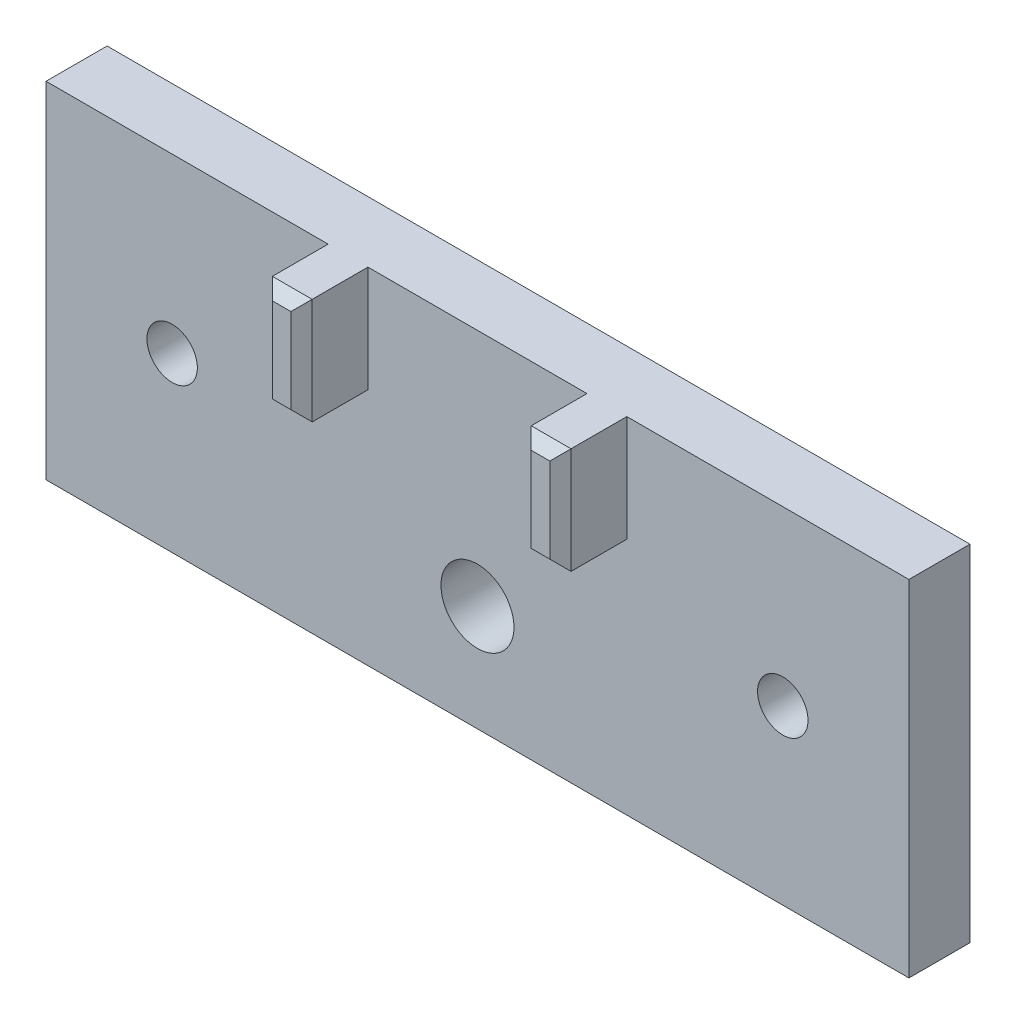
ISO-10303-21;
HEADER;
FILE_DESCRIPTION(('STEP AP214'),'2;1');
FILE_NAME('part.step','',(''),(''),'','','');
FILE_SCHEMA(('AUTOMOTIVE_DESIGN { 1 0 10303 214 1 1 1 1 }'));
ENDSEC;
DATA;
#1=APPLICATION_CONTEXT('core data for automotive mechanical design processes');
#2=APPLICATION_PROTOCOL_DEFINITION('international standard','automotive_design',2000,#1);
#3=PRODUCT_CONTEXT('',#1,'mechanical');
#4=PRODUCT('Part','Part','',(#3));
#5=PRODUCT_RELATED_PRODUCT_CATEGORY('part','',(#4));
#6=PRODUCT_DEFINITION_FORMATION('','',#4);
#7=PRODUCT_DEFINITION_CONTEXT('part definition',#1,'design');
#8=PRODUCT_DEFINITION('design','',#6,#7);
#9=PRODUCT_DEFINITION_SHAPE('','',#8);
#10=(LENGTH_UNIT() NAMED_UNIT(*) SI_UNIT(.MILLI.,.METRE.));
#11=(NAMED_UNIT(*) PLANE_ANGLE_UNIT() SI_UNIT($,.RADIAN.));
#12=(NAMED_UNIT(*) SI_UNIT($,.STERADIAN.) SOLID_ANGLE_UNIT());
#13=UNCERTAINTY_MEASURE_WITH_UNIT(LENGTH_MEASURE(1.E-05),#10,'distance_accuracy_value','');
#14=(GEOMETRIC_REPRESENTATION_CONTEXT(3) GLOBAL_UNCERTAINTY_ASSIGNED_CONTEXT((#13)) GLOBAL_UNIT_ASSIGNED_CONTEXT((#10,
#11,#12)) REPRESENTATION_CONTEXT('',''));
#15=CARTESIAN_POINT('',(0.,0.,0.));
#16=DIRECTION('',(0.,0.,1.));
#17=DIRECTION('',(1.,0.,0.));
#18=AXIS2_PLACEMENT_3D('',#15,#16,#17);
#19=CARTESIAN_POINT('',(0.,0.,5.));
#20=DIRECTION('',(0.,0.,-1.));
#21=DIRECTION('',(-1.,0.,0.));
#22=AXIS2_PLACEMENT_3D('',#19,#20,#21);
#23=PLANE('',#22);
#24=CARTESIAN_POINT('',(55.5,13.,5.));
#25=DIRECTION('',(0.,0.,-1.));
#26=DIRECTION('',(-1.,0.,0.));
#27=AXIS2_PLACEMENT_3D('',#24,#25,#26);
#28=CIRCLE('',#27,1.9);
#29=CARTESIAN_POINT('',(53.6,13.,5.));
#30=VERTEX_POINT('',#29);
#31=EDGE_CURVE('E288',#30,#30,#28,.T.);
#32=ORIENTED_EDGE('',*,*,#31,.T.);
#33=EDGE_LOOP('',(#32));
#34=FACE_BOUND('',#33,.T.);
#35=CARTESIAN_POINT('',(9.5,13.,5.));
#36=DIRECTION('',(0.,0.,-1.));
#37=DIRECTION('',(-1.,0.,0.));
#38=AXIS2_PLACEMENT_3D('',#35,#36,#37);
#39=CIRCLE('',#38,1.9);
#40=CARTESIAN_POINT('',(7.6,13.,5.));
#41=VERTEX_POINT('',#40);
#42=EDGE_CURVE('E199',#41,#41,#39,.T.);
#43=ORIENTED_EDGE('',*,*,#42,.T.);
#44=EDGE_LOOP('',(#43));
#45=FACE_BOUND('',#44,.T.);
#46=CARTESIAN_POINT('',(32.5,8.,5.));
#47=DIRECTION('',(0.,0.,1.));
#48=DIRECTION('',(1.,0.,0.));
#49=AXIS2_PLACEMENT_3D('',#46,#47,#48);
#50=CIRCLE('',#49,2.75);
#51=CARTESIAN_POINT('',(35.25,8.,5.));
#52=VERTEX_POINT('',#51);
#53=EDGE_CURVE('E224',#52,#52,#50,.T.);
#54=ORIENTED_EDGE('',*,*,#53,.F.);
#55=EDGE_LOOP('',(#54));
#56=FACE_BOUND('',#55,.T.);
#57=DIRECTION('',(0.,-1.,0.));
#58=VECTOR('',#57,1.);
#59=CARTESIAN_POINT('',(40.75,26.,5.));
#60=LINE('',#59,#58);
#61=CARTESIAN_POINT('',(40.75,26.,5.));
#62=VERTEX_POINT('',#61);
#63=CARTESIAN_POINT('',(40.75,18.,5.));
#64=VERTEX_POINT('',#63);
#65=EDGE_CURVE('E168',#62,#64,#60,.T.);
#66=ORIENTED_EDGE('',*,*,#65,.F.);
#67=DIRECTION('',(-1.,0.,0.));
#68=VECTOR('',#67,1.);
#69=CARTESIAN_POINT('',(0.,26.,5.));
#70=LINE('',#69,#68);
#71=CARTESIAN_POINT('',(24.25,26.,5.));
#72=VERTEX_POINT('',#71);
#73=EDGE_CURVE('E177',#62,#72,#70,.T.);
#74=ORIENTED_EDGE('',*,*,#73,.T.);
#75=DIRECTION('',(0.,1.,0.));
#76=VECTOR('',#75,1.);
#77=CARTESIAN_POINT('',(24.25,26.,5.));
#78=LINE('',#77,#76);
#79=CARTESIAN_POINT('',(24.25,18.,5.));
#80=VERTEX_POINT('',#79);
#81=EDGE_CURVE('E215',#80,#72,#78,.T.);
#82=ORIENTED_EDGE('',*,*,#81,.F.);
#83=DIRECTION('',(1.,0.,0.));
#84=VECTOR('',#83,1.);
#85=CARTESIAN_POINT('',(21.25,18.,5.));
#86=LINE('',#85,#84);
#87=CARTESIAN_POINT('',(21.25,18.,5.));
#88=VERTEX_POINT('',#87);
#89=EDGE_CURVE('E212',#88,#80,#86,.T.);
#90=ORIENTED_EDGE('',*,*,#89,.F.);
#91=DIRECTION('',(0.,-1.,0.));
#92=VECTOR('',#91,1.);
#93=CARTESIAN_POINT('',(21.25,26.,5.));
#94=LINE('',#93,#92);
#95=CARTESIAN_POINT('',(21.25,26.,5.));
#96=VERTEX_POINT('',#95);
#97=EDGE_CURVE('E209',#96,#88,#94,.T.);
#98=ORIENTED_EDGE('',*,*,#97,.F.);
#99=CARTESIAN_POINT('',(0.,26.,5.));
#100=VERTEX_POINT('',#99);
#101=EDGE_CURVE('E186',#96,#100,#70,.T.);
#102=ORIENTED_EDGE('',*,*,#101,.T.);
#103=DIRECTION('',(0.,-1.,0.));
#104=VECTOR('',#103,1.);
#105=CARTESIAN_POINT('',(0.,0.,5.));
#106=LINE('',#105,#104);
#107=CARTESIAN_POINT('',(0.,0.,5.));
#108=VERTEX_POINT('',#107);
#109=EDGE_CURVE('E227',#100,#108,#106,.T.);
#110=ORIENTED_EDGE('',*,*,#109,.T.);
#111=DIRECTION('',(1.,0.,0.));
#112=VECTOR('',#111,1.);
#113=CARTESIAN_POINT('',(0.,0.,5.));
#114=LINE('',#113,#112);
#115=CARTESIAN_POINT('',(65.,0.,5.));
#116=VERTEX_POINT('',#115);
#117=EDGE_CURVE('E230',#108,#116,#114,.T.);
#118=ORIENTED_EDGE('',*,*,#117,.T.);
#119=DIRECTION('',(0.,1.,0.));
#120=VECTOR('',#119,1.);
#121=CARTESIAN_POINT('',(65.,0.,5.));
#122=LINE('',#121,#120);
#123=CARTESIAN_POINT('',(65.,26.,5.));
#124=VERTEX_POINT('',#123);
#125=EDGE_CURVE('E232',#116,#124,#122,.T.);
#126=ORIENTED_EDGE('',*,*,#125,.T.);
#127=CARTESIAN_POINT('',(43.75,26.,5.));
#128=VERTEX_POINT('',#127);
#129=EDGE_CURVE('E185',#124,#128,#70,.T.);
#130=ORIENTED_EDGE('',*,*,#129,.T.);
#131=DIRECTION('',(0.,1.,0.));
#132=VECTOR('',#131,1.);
#133=CARTESIAN_POINT('',(43.75,26.,5.));
#134=LINE('',#133,#132);
#135=CARTESIAN_POINT('',(43.75,18.,5.));
#136=VERTEX_POINT('',#135);
#137=EDGE_CURVE('E174',#136,#128,#134,.T.);
#138=ORIENTED_EDGE('',*,*,#137,.F.);
#139=DIRECTION('',(1.,0.,0.));
#140=VECTOR('',#139,1.);
#141=CARTESIAN_POINT('',(40.75,18.,5.));
#142=LINE('',#141,#140);
#143=EDGE_CURVE('E191',#64,#136,#142,.T.);
#144=ORIENTED_EDGE('',*,*,#143,.F.);
#145=EDGE_LOOP('',(#66,#74,#82,#90,#98,#102,#110,#118,#126,#130,#138,#144));
#146=FACE_BOUND('',#145,.T.);
#147=ADVANCED_FACE('F33',(#34,#45,#56,#146),#23,.F.);
#148=CARTESIAN_POINT('',(0.,0.,5.));
#149=DIRECTION('',(1.,0.,0.));
#150=DIRECTION('',(0.,0.,-1.));
#151=AXIS2_PLACEMENT_3D('',#148,#149,#150);
#152=PLANE('',#151);
#153=DIRECTION('',(0.,0.,-1.));
#154=VECTOR('',#153,1.);
#155=CARTESIAN_POINT('',(0.,26.,5.));
#156=LINE('',#155,#154);
#157=CARTESIAN_POINT('',(0.,26.,0.399999999999998));
#158=VERTEX_POINT('',#157);
#159=EDGE_CURVE('E235',#100,#158,#156,.T.);
#160=ORIENTED_EDGE('',*,*,#159,.T.);
#161=DIRECTION('',(0.,-1.,0.));
#162=VECTOR('',#161,1.);
#163=CARTESIAN_POINT('',(0.,0.,0.399999999999998));
#164=LINE('',#163,#162);
#165=CARTESIAN_POINT('',(0.,0.,0.399999999999998));
#166=VERTEX_POINT('',#165);
#167=EDGE_CURVE('E317',#158,#166,#164,.T.);
#168=ORIENTED_EDGE('',*,*,#167,.T.);
#169=DIRECTION('',(0.,0.,-1.));
#170=VECTOR('',#169,1.);
#171=CARTESIAN_POINT('',(0.,0.,5.));
#172=LINE('',#171,#170);
#173=EDGE_CURVE('E241',#108,#166,#172,.T.);
#174=ORIENTED_EDGE('',*,*,#173,.F.);
#175=ORIENTED_EDGE('',*,*,#109,.F.);
#176=EDGE_LOOP('',(#160,#168,#174,#175));
#177=FACE_BOUND('',#176,.T.);
#178=ADVANCED_FACE('F361',(#177),#152,.F.);
#179=CARTESIAN_POINT('',(0.,0.,5.));
#180=DIRECTION('',(0.,1.,0.));
#181=DIRECTION('',(0.,0.,1.));
#182=AXIS2_PLACEMENT_3D('',#179,#180,#181);
#183=PLANE('',#182);
#184=ORIENTED_EDGE('',*,*,#173,.T.);
#185=DIRECTION('',(1.,0.,0.));
#186=VECTOR('',#185,1.);
#187=CARTESIAN_POINT('',(65.,0.,0.399999999999998));
#188=LINE('',#187,#186);
#189=CARTESIAN_POINT('',(65.,0.,0.399999999999998));
#190=VERTEX_POINT('',#189);
#191=EDGE_CURVE('E277',#166,#190,#188,.T.);
#192=ORIENTED_EDGE('',*,*,#191,.T.);
#193=DIRECTION('',(0.,0.,-1.));
#194=VECTOR('',#193,1.);
#195=CARTESIAN_POINT('',(65.,0.,5.));
#196=LINE('',#195,#194);
#197=EDGE_CURVE('E239',#116,#190,#196,.T.);
#198=ORIENTED_EDGE('',*,*,#197,.F.);
#199=ORIENTED_EDGE('',*,*,#117,.F.);
#200=EDGE_LOOP('',(#184,#192,#198,#199));
#201=FACE_BOUND('',#200,.T.);
#202=ADVANCED_FACE('F366',(#201),#183,.F.);
#203=CARTESIAN_POINT('',(65.,0.,5.));
#204=DIRECTION('',(-1.,0.,0.));
#205=DIRECTION('',(0.,0.,1.));
#206=AXIS2_PLACEMENT_3D('',#203,#204,#205);
#207=PLANE('',#206);
#208=ORIENTED_EDGE('',*,*,#197,.T.);
#209=DIRECTION('',(0.,1.,0.));
#210=VECTOR('',#209,1.);
#211=CARTESIAN_POINT('',(65.,26.,0.399999999999998));
#212=LINE('',#211,#210);
#213=CARTESIAN_POINT('',(65.,26.,0.399999999999998));
#214=VERTEX_POINT('',#213);
#215=EDGE_CURVE('E58',#190,#214,#212,.T.);
#216=ORIENTED_EDGE('',*,*,#215,.T.);
#217=DIRECTION('',(0.,0.,-1.));
#218=VECTOR('',#217,1.);
#219=CARTESIAN_POINT('',(65.,26.,5.));
#220=LINE('',#219,#218);
#221=EDGE_CURVE('E237',#124,#214,#220,.T.);
#222=ORIENTED_EDGE('',*,*,#221,.F.);
#223=ORIENTED_EDGE('',*,*,#125,.F.);
#224=EDGE_LOOP('',(#208,#216,#222,#223));
#225=FACE_BOUND('',#224,.T.);
#226=ADVANCED_FACE('F379',(#225),#207,.F.);
#227=CARTESIAN_POINT('',(0.,26.,5.));
#228=DIRECTION('',(0.,-1.,0.));
#229=DIRECTION('',(0.,0.,-1.));
#230=AXIS2_PLACEMENT_3D('',#227,#228,#229);
#231=PLANE('',#230);
#232=ORIENTED_EDGE('',*,*,#221,.T.);
#233=DIRECTION('',(-1.,0.,0.));
#234=VECTOR('',#233,1.);
#235=CARTESIAN_POINT('',(0.,26.,0.399999999999998));
#236=LINE('',#235,#234);
#237=EDGE_CURVE('E50',#214,#158,#236,.T.);
#238=ORIENTED_EDGE('',*,*,#237,.T.);
#239=ORIENTED_EDGE('',*,*,#159,.F.);
#240=ORIENTED_EDGE('',*,*,#101,.F.);
#241=DIRECTION('',(0.,0.,-1.));
#242=VECTOR('',#241,1.);
#243=CARTESIAN_POINT('',(21.25,26.,10.));
#244=LINE('',#243,#242);
#245=CARTESIAN_POINT('',(21.25,26.,9.19999999999999));
#246=VERTEX_POINT('',#245);
#247=EDGE_CURVE('E217',#246,#96,#244,.T.);
#248=ORIENTED_EDGE('',*,*,#247,.F.);
#249=DIRECTION('',(1.,0.,0.));
#250=VECTOR('',#249,1.);
#251=CARTESIAN_POINT('',(24.25,26.,9.19999999999999));
#252=LINE('',#251,#250);
#253=CARTESIAN_POINT('',(24.25,26.,9.19999999999999));
#254=VERTEX_POINT('',#253);
#255=EDGE_CURVE('E253',#246,#254,#252,.T.);
#256=ORIENTED_EDGE('',*,*,#255,.T.);
#257=DIRECTION('',(0.,0.,-1.));
#258=VECTOR('',#257,1.);
#259=CARTESIAN_POINT('',(24.25,26.,10.));
#260=LINE('',#259,#258);
#261=EDGE_CURVE('E181',#254,#72,#260,.T.);
#262=ORIENTED_EDGE('',*,*,#261,.T.);
#263=ORIENTED_EDGE('',*,*,#73,.F.);
#264=DIRECTION('',(0.,0.,-1.));
#265=VECTOR('',#264,1.);
#266=CARTESIAN_POINT('',(40.75,26.,10.));
#267=LINE('',#266,#265);
#268=CARTESIAN_POINT('',(40.75,26.,9.2));
#269=VERTEX_POINT('',#268);
#270=EDGE_CURVE('E163',#269,#62,#267,.T.);
#271=ORIENTED_EDGE('',*,*,#270,.F.);
#272=DIRECTION('',(1.,0.,0.));
#273=VECTOR('',#272,1.);
#274=CARTESIAN_POINT('',(43.75,26.,9.2));
#275=LINE('',#274,#273);
#276=CARTESIAN_POINT('',(43.75,26.,9.2));
#277=VERTEX_POINT('',#276);
#278=EDGE_CURVE('E255',#269,#277,#275,.T.);
#279=ORIENTED_EDGE('',*,*,#278,.T.);
#280=DIRECTION('',(0.,0.,-1.));
#281=VECTOR('',#280,1.);
#282=CARTESIAN_POINT('',(43.75,26.,10.));
#283=LINE('',#282,#281);
#284=EDGE_CURVE('E173',#277,#128,#283,.T.);
#285=ORIENTED_EDGE('',*,*,#284,.T.);
#286=ORIENTED_EDGE('',*,*,#129,.F.);
#287=EDGE_LOOP('',(#232,#238,#239,#240,#248,#256,#262,#263,#271,#279,#285,#286));
#288=FACE_BOUND('',#287,.T.);
#289=ADVANCED_FACE('F178',(#288),#231,.F.);
#290=CARTESIAN_POINT('',(0.,0.,0.));
#291=DIRECTION('',(0.,0.,-1.));
#292=DIRECTION('',(-1.,0.,0.));
#293=AXIS2_PLACEMENT_3D('',#290,#291,#292);
#294=PLANE('',#293);
#295=DIRECTION('',(0.,-1.,0.));
#296=VECTOR('',#295,1.);
#297=CARTESIAN_POINT('',(64.6,0.,0.));
#298=LINE('',#297,#296);
#299=CARTESIAN_POINT('',(64.6,25.6,0.));
#300=VERTEX_POINT('',#299);
#301=CARTESIAN_POINT('',(64.6,0.399999999999998,0.));
#302=VERTEX_POINT('',#301);
#303=EDGE_CURVE('E310',#300,#302,#298,.T.);
#304=ORIENTED_EDGE('',*,*,#303,.T.);
#305=DIRECTION('',(-1.,0.,0.));
#306=VECTOR('',#305,1.);
#307=CARTESIAN_POINT('',(0.,0.399999999999998,0.));
#308=LINE('',#307,#306);
#309=CARTESIAN_POINT('',(0.399999999999998,0.399999999999998,0.));
#310=VERTEX_POINT('',#309);
#311=EDGE_CURVE('E312',#302,#310,#308,.T.);
#312=ORIENTED_EDGE('',*,*,#311,.T.);
#313=DIRECTION('',(0.,1.,0.));
#314=VECTOR('',#313,1.);
#315=CARTESIAN_POINT('',(0.399999999999998,26.,0.));
#316=LINE('',#315,#314);
#317=CARTESIAN_POINT('',(0.399999999999998,25.6,0.));
#318=VERTEX_POINT('',#317);
#319=EDGE_CURVE('E306',#310,#318,#316,.T.);
#320=ORIENTED_EDGE('',*,*,#319,.T.);
#321=DIRECTION('',(1.,0.,0.));
#322=VECTOR('',#321,1.);
#323=CARTESIAN_POINT('',(65.,25.6,0.));
#324=LINE('',#323,#322);
#325=EDGE_CURVE('E308',#318,#300,#324,.T.);
#326=ORIENTED_EDGE('',*,*,#325,.T.);
#327=EDGE_LOOP('',(#304,#312,#320,#326));
#328=FACE_BOUND('',#327,.T.);
#329=CARTESIAN_POINT('',(32.5,8.,0.));
#330=DIRECTION('',(0.,0.,-1.));
#331=DIRECTION('',(-1.,0.,0.));
#332=AXIS2_PLACEMENT_3D('',#329,#330,#331);
#333=CIRCLE('',#332,3.14999999999999);
#334=CARTESIAN_POINT('',(29.35,8.,0.));
#335=VERTEX_POINT('',#334);
#336=EDGE_CURVE('E303',#335,#335,#333,.F.);
#337=ORIENTED_EDGE('',*,*,#336,.T.);
#338=EDGE_LOOP('',(#337));
#339=FACE_BOUND('',#338,.T.);
#340=CARTESIAN_POINT('',(9.5,13.,0.));
#341=DIRECTION('',(0.,0.,-1.));
#342=DIRECTION('',(-1.,0.,0.));
#343=AXIS2_PLACEMENT_3D('',#340,#341,#342);
#344=CIRCLE('',#343,2.30000000000001);
#345=CARTESIAN_POINT('',(7.19999999999999,13.,0.));
#346=VERTEX_POINT('',#345);
#347=EDGE_CURVE('E300',#346,#346,#344,.F.);
#348=ORIENTED_EDGE('',*,*,#347,.T.);
#349=EDGE_LOOP('',(#348));
#350=FACE_BOUND('',#349,.T.);
#351=CARTESIAN_POINT('',(55.5,13.,0.));
#352=DIRECTION('',(0.,0.,-1.));
#353=DIRECTION('',(-1.,0.,0.));
#354=AXIS2_PLACEMENT_3D('',#351,#352,#353);
#355=CIRCLE('',#354,2.29999999999999);
#356=CARTESIAN_POINT('',(53.2,13.,0.));
#357=VERTEX_POINT('',#356);
#358=EDGE_CURVE('E297',#357,#357,#355,.F.);
#359=ORIENTED_EDGE('',*,*,#358,.T.);
#360=EDGE_LOOP('',(#359));
#361=FACE_BOUND('',#360,.T.);
#362=ADVANCED_FACE('F373',(#328,#339,#350,#361),#294,.T.);
#363=CARTESIAN_POINT('',(32.5,8.,0.));
#364=DIRECTION('',(0.,0.,1.));
#365=DIRECTION('',(1.,0.,0.));
#366=AXIS2_PLACEMENT_3D('',#363,#364,#365);
#367=CYLINDRICAL_SURFACE('',#366,2.75);
#368=CARTESIAN_POINT('',(32.5,8.,0.399999999999994));
#369=DIRECTION('',(0.,0.,-1.));
#370=DIRECTION('',(-1.,0.,0.));
#371=AXIS2_PLACEMENT_3D('',#368,#369,#370);
#372=CIRCLE('',#371,2.75);
#373=CARTESIAN_POINT('',(29.75,8.,0.399999999999994));
#374=VERTEX_POINT('',#373);
#375=EDGE_CURVE('E319',#374,#374,#372,.T.);
#376=ORIENTED_EDGE('',*,*,#375,.T.);
#377=EDGE_LOOP('',(#376));
#378=FACE_BOUND('',#377,.T.);
#379=ORIENTED_EDGE('',*,*,#53,.T.);
#380=EDGE_LOOP('',(#379));
#381=FACE_BOUND('',#380,.T.);
#382=ADVANCED_FACE('F371',(#378,#381),#367,.F.);
#383=CARTESIAN_POINT('',(21.25,26.,10.));
#384=DIRECTION('',(1.,0.,0.));
#385=DIRECTION('',(0.,0.,-1.));
#386=AXIS2_PLACEMENT_3D('',#383,#384,#385);
#387=PLANE('',#386);
#388=DIRECTION('',(0.,0.,-1.));
#389=VECTOR('',#388,1.);
#390=CARTESIAN_POINT('',(21.25,18.,10.));
#391=LINE('',#390,#389);
#392=CARTESIAN_POINT('',(21.25,18.,9.19999999999999));
#393=VERTEX_POINT('',#392);
#394=EDGE_CURVE('E222',#393,#88,#391,.T.);
#395=ORIENTED_EDGE('',*,*,#394,.F.);
#396=DIRECTION('',(0.,1.,0.));
#397=VECTOR('',#396,1.);
#398=CARTESIAN_POINT('',(21.25,26.,9.19999999999999));
#399=LINE('',#398,#397);
#400=EDGE_CURVE('E275',#393,#246,#399,.T.);
#401=ORIENTED_EDGE('',*,*,#400,.T.);
#402=ORIENTED_EDGE('',*,*,#247,.T.);
#403=ORIENTED_EDGE('',*,*,#97,.T.);
#404=EDGE_LOOP('',(#395,#401,#402,#403));
#405=FACE_BOUND('',#404,.T.);
#406=ADVANCED_FACE('F501',(#405),#387,.F.);
#407=CARTESIAN_POINT('',(21.25,18.,10.));
#408=DIRECTION('',(0.,1.,0.));
#409=DIRECTION('',(0.,0.,1.));
#410=AXIS2_PLACEMENT_3D('',#407,#408,#409);
#411=PLANE('',#410);
#412=DIRECTION('',(0.,0.,-1.));
#413=VECTOR('',#412,1.);
#414=CARTESIAN_POINT('',(24.25,18.,10.));
#415=LINE('',#414,#413);
#416=CARTESIAN_POINT('',(24.25,18.,9.19999999999999));
#417=VERTEX_POINT('',#416);
#418=EDGE_CURVE('E220',#417,#80,#415,.T.);
#419=ORIENTED_EDGE('',*,*,#418,.F.);
#420=DIRECTION('',(-1.,0.,0.));
#421=VECTOR('',#420,1.);
#422=CARTESIAN_POINT('',(21.25,18.,9.19999999999999));
#423=LINE('',#422,#421);
#424=EDGE_CURVE('E273',#417,#393,#423,.T.);
#425=ORIENTED_EDGE('',*,*,#424,.T.);
#426=ORIENTED_EDGE('',*,*,#394,.T.);
#427=ORIENTED_EDGE('',*,*,#89,.T.);
#428=EDGE_LOOP('',(#419,#425,#426,#427));
#429=FACE_BOUND('',#428,.T.);
#430=ADVANCED_FACE('F643',(#429),#411,.F.);
#431=CARTESIAN_POINT('',(24.25,26.,10.));
#432=DIRECTION('',(-1.,0.,0.));
#433=DIRECTION('',(0.,0.,1.));
#434=AXIS2_PLACEMENT_3D('',#431,#432,#433);
#435=PLANE('',#434);
#436=ORIENTED_EDGE('',*,*,#261,.F.);
#437=DIRECTION('',(0.,-1.,0.));
#438=VECTOR('',#437,1.);
#439=CARTESIAN_POINT('',(24.25,18.,9.19999999999999));
#440=LINE('',#439,#438);
#441=EDGE_CURVE('E271',#254,#417,#440,.T.);
#442=ORIENTED_EDGE('',*,*,#441,.T.);
#443=ORIENTED_EDGE('',*,*,#418,.T.);
#444=ORIENTED_EDGE('',*,*,#81,.T.);
#445=EDGE_LOOP('',(#436,#442,#443,#444));
#446=FACE_BOUND('',#445,.T.);
#447=ADVANCED_FACE('F633',(#446),#435,.F.);
#448=CARTESIAN_POINT('',(0.,0.,10.));
#449=DIRECTION('',(0.,0.,1.));
#450=DIRECTION('',(1.,0.,0.));
#451=AXIS2_PLACEMENT_3D('',#448,#449,#450);
#452=PLANE('',#451);
#453=DIRECTION('',(0.,1.,0.));
#454=VECTOR('',#453,1.);
#455=CARTESIAN_POINT('',(23.45,26.,10.));
#456=LINE('',#455,#454);
#457=CARTESIAN_POINT('',(23.45,18.8,10.));
#458=VERTEX_POINT('',#457);
#459=CARTESIAN_POINT('',(23.45,25.2,10.));
#460=VERTEX_POINT('',#459);
#461=EDGE_CURVE('E266',#458,#460,#456,.T.);
#462=ORIENTED_EDGE('',*,*,#461,.T.);
#463=DIRECTION('',(-1.,0.,0.));
#464=VECTOR('',#463,1.);
#465=CARTESIAN_POINT('',(21.25,25.2,10.));
#466=LINE('',#465,#464);
#467=CARTESIAN_POINT('',(22.05,25.2,10.));
#468=VERTEX_POINT('',#467);
#469=EDGE_CURVE('E268',#460,#468,#466,.T.);
#470=ORIENTED_EDGE('',*,*,#469,.T.);
#471=DIRECTION('',(0.,-1.,0.));
#472=VECTOR('',#471,1.);
#473=CARTESIAN_POINT('',(22.05,18.,10.));
#474=LINE('',#473,#472);
#475=CARTESIAN_POINT('',(22.05,18.8,10.));
#476=VERTEX_POINT('',#475);
#477=EDGE_CURVE('E262',#468,#476,#474,.T.);
#478=ORIENTED_EDGE('',*,*,#477,.T.);
#479=DIRECTION('',(1.,0.,0.));
#480=VECTOR('',#479,1.);
#481=CARTESIAN_POINT('',(24.25,18.8,10.));
#482=LINE('',#481,#480);
#483=EDGE_CURVE('E264',#476,#458,#482,.T.);
#484=ORIENTED_EDGE('',*,*,#483,.T.);
#485=EDGE_LOOP('',(#462,#470,#478,#484));
#486=FACE_BOUND('',#485,.T.);
#487=ADVANCED_FACE('F624',(#486),#452,.T.);
#488=CARTESIAN_POINT('',(40.75,26.,10.));
#489=DIRECTION('',(1.,0.,0.));
#490=DIRECTION('',(0.,0.,-1.));
#491=AXIS2_PLACEMENT_3D('',#488,#489,#490);
#492=PLANE('',#491);
#493=DIRECTION('',(0.,0.,-1.));
#494=VECTOR('',#493,1.);
#495=CARTESIAN_POINT('',(40.75,18.,10.));
#496=LINE('',#495,#494);
#497=CARTESIAN_POINT('',(40.75,18.,9.2));
#498=VERTEX_POINT('',#497);
#499=EDGE_CURVE('E207',#498,#64,#496,.T.);
#500=ORIENTED_EDGE('',*,*,#499,.F.);
#501=DIRECTION('',(0.,1.,0.));
#502=VECTOR('',#501,1.);
#503=CARTESIAN_POINT('',(40.75,26.,9.2));
#504=LINE('',#503,#502);
#505=EDGE_CURVE('E170',#498,#269,#504,.T.);
#506=ORIENTED_EDGE('',*,*,#505,.T.);
#507=ORIENTED_EDGE('',*,*,#270,.T.);
#508=ORIENTED_EDGE('',*,*,#65,.T.);
#509=EDGE_LOOP('',(#500,#506,#507,#508));
#510=FACE_BOUND('',#509,.T.);
#511=ADVANCED_FACE('F166',(#510),#492,.F.);
#512=CARTESIAN_POINT('',(40.75,18.,10.));
#513=DIRECTION('',(0.,1.,0.));
#514=DIRECTION('',(0.,0.,1.));
#515=AXIS2_PLACEMENT_3D('',#512,#513,#514);
#516=PLANE('',#515);
#517=DIRECTION('',(0.,0.,-1.));
#518=VECTOR('',#517,1.);
#519=CARTESIAN_POINT('',(43.75,18.,10.));
#520=LINE('',#519,#518);
#521=CARTESIAN_POINT('',(43.75,18.,9.2));
#522=VERTEX_POINT('',#521);
#523=EDGE_CURVE('E205',#522,#136,#520,.T.);
#524=ORIENTED_EDGE('',*,*,#523,.F.);
#525=DIRECTION('',(-1.,0.,0.));
#526=VECTOR('',#525,1.);
#527=CARTESIAN_POINT('',(40.75,18.,9.2));
#528=LINE('',#527,#526);
#529=EDGE_CURVE('E259',#522,#498,#528,.T.);
#530=ORIENTED_EDGE('',*,*,#529,.T.);
#531=ORIENTED_EDGE('',*,*,#499,.T.);
#532=ORIENTED_EDGE('',*,*,#143,.T.);
#533=EDGE_LOOP('',(#524,#530,#531,#532));
#534=FACE_BOUND('',#533,.T.);
#535=ADVANCED_FACE('F605',(#534),#516,.F.);
#536=CARTESIAN_POINT('',(43.75,26.,10.));
#537=DIRECTION('',(-1.,0.,0.));
#538=DIRECTION('',(0.,0.,1.));
#539=AXIS2_PLACEMENT_3D('',#536,#537,#538);
#540=PLANE('',#539);
#541=ORIENTED_EDGE('',*,*,#284,.F.);
#542=DIRECTION('',(0.,-1.,0.));
#543=VECTOR('',#542,1.);
#544=CARTESIAN_POINT('',(43.75,18.,9.2));
#545=LINE('',#544,#543);
#546=EDGE_CURVE('E257',#277,#522,#545,.T.);
#547=ORIENTED_EDGE('',*,*,#546,.T.);
#548=ORIENTED_EDGE('',*,*,#523,.T.);
#549=ORIENTED_EDGE('',*,*,#137,.T.);
#550=EDGE_LOOP('',(#541,#547,#548,#549));
#551=FACE_BOUND('',#550,.T.);
#552=ADVANCED_FACE('F595',(#551),#540,.F.);
#553=CARTESIAN_POINT('',(0.,0.,10.));
#554=DIRECTION('',(0.,0.,1.));
#555=DIRECTION('',(1.,0.,0.));
#556=AXIS2_PLACEMENT_3D('',#553,#554,#555);
#557=PLANE('',#556);
#558=DIRECTION('',(0.,1.,0.));
#559=VECTOR('',#558,1.);
#560=CARTESIAN_POINT('',(42.95,26.,10.));
#561=LINE('',#560,#559);
#562=CARTESIAN_POINT('',(42.95,18.8,10.));
#563=VERTEX_POINT('',#562);
#564=CARTESIAN_POINT('',(42.95,25.2,10.));
#565=VERTEX_POINT('',#564);
#566=EDGE_CURVE('E248',#563,#565,#561,.T.);
#567=ORIENTED_EDGE('',*,*,#566,.T.);
#568=DIRECTION('',(-1.,0.,0.));
#569=VECTOR('',#568,1.);
#570=CARTESIAN_POINT('',(40.75,25.2,10.));
#571=LINE('',#570,#569);
#572=CARTESIAN_POINT('',(41.55,25.2,10.));
#573=VERTEX_POINT('',#572);
#574=EDGE_CURVE('E250',#565,#573,#571,.T.);
#575=ORIENTED_EDGE('',*,*,#574,.T.);
#576=DIRECTION('',(0.,-1.,0.));
#577=VECTOR('',#576,1.);
#578=CARTESIAN_POINT('',(41.55,18.,10.));
#579=LINE('',#578,#577);
#580=CARTESIAN_POINT('',(41.55,18.8,10.));
#581=VERTEX_POINT('',#580);
#582=EDGE_CURVE('E244',#573,#581,#579,.T.);
#583=ORIENTED_EDGE('',*,*,#582,.T.);
#584=DIRECTION('',(1.,0.,0.));
#585=VECTOR('',#584,1.);
#586=CARTESIAN_POINT('',(43.75,18.8,10.));
#587=LINE('',#586,#585);
#588=EDGE_CURVE('E246',#581,#563,#587,.T.);
#589=ORIENTED_EDGE('',*,*,#588,.T.);
#590=EDGE_LOOP('',(#567,#575,#583,#589));
#591=FACE_BOUND('',#590,.T.);
#592=ADVANCED_FACE('F401',(#591),#557,.T.);
#593=CARTESIAN_POINT('',(0.,18.8,10.));
#594=DIRECTION('',(0.,-0.707106781186544,0.707106781186551));
#595=DIRECTION('',(-1.,0.,0.));
#596=AXIS2_PLACEMENT_3D('',#593,#594,#595);
#597=PLANE('',#596);
#598=DIRECTION('',(0.577350269189627,0.577350269189627,0.577350269189622));
#599=VECTOR('',#598,1.);
#600=CARTESIAN_POINT('',(35.2833333333333,12.5333333333333,3.73333333333335));
#601=LINE('',#600,#599);
#602=EDGE_CURVE('E196',#498,#581,#601,.T.);
#603=ORIENTED_EDGE('',*,*,#602,.F.);
#604=ORIENTED_EDGE('',*,*,#529,.F.);
#605=DIRECTION('',(-0.577350269189627,0.577350269189627,0.577350269189622));
#606=VECTOR('',#605,1.);
#607=CARTESIAN_POINT('',(28.6333333333333,33.1166666666668,24.3166666666666));
#608=LINE('',#607,#606);
#609=EDGE_CURVE('E192',#563,#522,#608,.F.);
#610=ORIENTED_EDGE('',*,*,#609,.F.);
#611=ORIENTED_EDGE('',*,*,#588,.F.);
#612=EDGE_LOOP('',(#603,#604,#610,#611));
#613=FACE_BOUND('',#612,.T.);
#614=ADVANCED_FACE('F397',(#613),#597,.T.);
#615=CARTESIAN_POINT('',(42.95,0.,10.));
#616=DIRECTION('',(0.707106781186544,0.,0.707106781186551));
#617=DIRECTION('',(0.,-1.,0.));
#618=AXIS2_PLACEMENT_3D('',#615,#616,#617);
#619=PLANE('',#618);
#620=ORIENTED_EDGE('',*,*,#609,.T.);
#621=ORIENTED_EDGE('',*,*,#546,.F.);
#622=DIRECTION('',(-0.577350269189627,-0.577350269189627,0.577350269189622));
#623=VECTOR('',#622,1.);
#624=CARTESIAN_POINT('',(34.5499999999999,16.8,18.4));
#625=LINE('',#624,#623);
#626=EDGE_CURVE('E280',#565,#277,#625,.F.);
#627=ORIENTED_EDGE('',*,*,#626,.F.);
#628=ORIENTED_EDGE('',*,*,#566,.F.);
#629=EDGE_LOOP('',(#620,#621,#627,#628));
#630=FACE_BOUND('',#629,.T.);
#631=ADVANCED_FACE('F393',(#630),#619,.T.);
#632=CARTESIAN_POINT('',(41.55,0.,10.));
#633=DIRECTION('',(-0.707106781186544,0.,0.707106781186551));
#634=DIRECTION('',(0.,1.,0.));
#635=AXIS2_PLACEMENT_3D('',#632,#633,#634);
#636=PLANE('',#635);
#637=ORIENTED_EDGE('',*,*,#602,.T.);
#638=ORIENTED_EDGE('',*,*,#582,.F.);
#639=DIRECTION('',(-0.577350269189627,0.577350269189627,-0.577350269189622));
#640=VECTOR('',#639,1.);
#641=CARTESIAN_POINT('',(49.95,16.8,18.4));
#642=LINE('',#641,#640);
#643=EDGE_CURVE('E278',#269,#573,#642,.F.);
#644=ORIENTED_EDGE('',*,*,#643,.F.);
#645=ORIENTED_EDGE('',*,*,#505,.F.);
#646=EDGE_LOOP('',(#637,#638,#644,#645));
#647=FACE_BOUND('',#646,.T.);
#648=ADVANCED_FACE('F389',(#647),#636,.T.);
#649=CARTESIAN_POINT('',(0.,25.2,10.));
#650=DIRECTION('',(0.,0.707106781186544,0.707106781186551));
#651=DIRECTION('',(1.,0.,0.));
#652=AXIS2_PLACEMENT_3D('',#649,#650,#651);
#653=PLANE('',#652);
#654=ORIENTED_EDGE('',*,*,#626,.T.);
#655=ORIENTED_EDGE('',*,*,#278,.F.);
#656=ORIENTED_EDGE('',*,*,#643,.T.);
#657=ORIENTED_EDGE('',*,*,#574,.F.);
#658=EDGE_LOOP('',(#654,#655,#656,#657));
#659=FACE_BOUND('',#658,.T.);
#660=ADVANCED_FACE('F385',(#659),#653,.T.);
#661=CARTESIAN_POINT('',(0.,18.8,10.));
#662=DIRECTION('',(0.,-0.707106781186554,0.707106781186541));
#663=DIRECTION('',(-1.,0.,0.));
#664=AXIS2_PLACEMENT_3D('',#661,#662,#663);
#665=PLANE('',#664);
#666=DIRECTION('',(0.577350269189622,0.577350269189622,0.577350269189632));
#667=VECTOR('',#666,1.);
#668=CARTESIAN_POINT('',(15.7833333333334,12.5333333333334,3.7333333333333));
#669=LINE('',#668,#667);
#670=EDGE_CURVE('E290',#393,#476,#669,.T.);
#671=ORIENTED_EDGE('',*,*,#670,.F.);
#672=ORIENTED_EDGE('',*,*,#424,.F.);
#673=DIRECTION('',(-0.577350269189622,0.577350269189622,0.577350269189632));
#674=VECTOR('',#673,1.);
#675=CARTESIAN_POINT('',(15.6333333333334,26.6166666666666,17.8166666666667));
#676=LINE('',#675,#674);
#677=EDGE_CURVE('E281',#458,#417,#676,.F.);
#678=ORIENTED_EDGE('',*,*,#677,.F.);
#679=ORIENTED_EDGE('',*,*,#483,.F.);
#680=EDGE_LOOP('',(#671,#672,#678,#679));
#681=FACE_BOUND('',#680,.T.);
#682=ADVANCED_FACE('F388',(#681),#665,.T.);
#683=CARTESIAN_POINT('',(23.45,0.,10.));
#684=DIRECTION('',(0.707106781186554,0.,0.707106781186541));
#685=DIRECTION('',(0.,-1.,0.));
#686=AXIS2_PLACEMENT_3D('',#683,#684,#685);
#687=PLANE('',#686);
#688=ORIENTED_EDGE('',*,*,#677,.T.);
#689=ORIENTED_EDGE('',*,*,#441,.F.);
#690=DIRECTION('',(-0.577350269189622,-0.577350269189622,0.577350269189632));
#691=VECTOR('',#690,1.);
#692=CARTESIAN_POINT('',(15.0500000000001,16.8000000000001,18.4));
#693=LINE('',#692,#691);
#694=EDGE_CURVE('E287',#460,#254,#693,.F.);
#695=ORIENTED_EDGE('',*,*,#694,.F.);
#696=ORIENTED_EDGE('',*,*,#461,.F.);
#697=EDGE_LOOP('',(#688,#689,#695,#696));
#698=FACE_BOUND('',#697,.T.);
#699=ADVANCED_FACE('F409',(#698),#687,.T.);
#700=CARTESIAN_POINT('',(22.05,0.,10.));
#701=DIRECTION('',(-0.707106781186554,0.,0.707106781186541));
#702=DIRECTION('',(0.,1.,0.));
#703=AXIS2_PLACEMENT_3D('',#700,#701,#702);
#704=PLANE('',#703);
#705=ORIENTED_EDGE('',*,*,#670,.T.);
#706=ORIENTED_EDGE('',*,*,#477,.F.);
#707=DIRECTION('',(-0.577350269189622,0.577350269189622,-0.577350269189632));
#708=VECTOR('',#707,1.);
#709=CARTESIAN_POINT('',(30.4499999999999,16.8000000000001,18.4));
#710=LINE('',#709,#708);
#711=EDGE_CURVE('E285',#246,#468,#710,.F.);
#712=ORIENTED_EDGE('',*,*,#711,.F.);
#713=ORIENTED_EDGE('',*,*,#400,.F.);
#714=EDGE_LOOP('',(#705,#706,#712,#713));
#715=FACE_BOUND('',#714,.T.);
#716=ADVANCED_FACE('F405',(#715),#704,.T.);
#717=CARTESIAN_POINT('',(0.,25.2,10.));
#718=DIRECTION('',(0.,0.707106781186554,0.707106781186541));
#719=DIRECTION('',(1.,0.,0.));
#720=AXIS2_PLACEMENT_3D('',#717,#718,#719);
#721=PLANE('',#720);
#722=ORIENTED_EDGE('',*,*,#694,.T.);
#723=ORIENTED_EDGE('',*,*,#255,.F.);
#724=ORIENTED_EDGE('',*,*,#711,.T.);
#725=ORIENTED_EDGE('',*,*,#469,.F.);
#726=EDGE_LOOP('',(#722,#723,#724,#725));
#727=FACE_BOUND('',#726,.T.);
#728=ADVANCED_FACE('F357',(#727),#721,.T.);
#729=CARTESIAN_POINT('',(9.5,13.,5.));
#730=DIRECTION('',(0.,0.,-1.));
#731=DIRECTION('',(-1.,0.,0.));
#732=AXIS2_PLACEMENT_3D('',#729,#730,#731);
#733=CYLINDRICAL_SURFACE('',#732,1.9);
#734=CARTESIAN_POINT('',(9.5,13.,0.400000000000003));
#735=DIRECTION('',(0.,0.,-1.));
#736=DIRECTION('',(-1.,0.,0.));
#737=AXIS2_PLACEMENT_3D('',#734,#735,#736);
#738=CIRCLE('',#737,1.9);
#739=CARTESIAN_POINT('',(7.6,13.,0.400000000000003));
#740=VERTEX_POINT('',#739);
#741=EDGE_CURVE('E42',#740,#740,#738,.T.);
#742=ORIENTED_EDGE('',*,*,#741,.T.);
#743=EDGE_LOOP('',(#742));
#744=FACE_BOUND('',#743,.T.);
#745=ORIENTED_EDGE('',*,*,#42,.F.);
#746=EDGE_LOOP('',(#745));
#747=FACE_BOUND('',#746,.T.);
#748=ADVANCED_FACE('F347',(#744,#747),#733,.F.);
#749=CARTESIAN_POINT('',(55.5,13.,5.));
#750=DIRECTION('',(0.,0.,-1.));
#751=DIRECTION('',(-1.,0.,0.));
#752=AXIS2_PLACEMENT_3D('',#749,#750,#751);
#753=CYLINDRICAL_SURFACE('',#752,1.9);
#754=CARTESIAN_POINT('',(55.5,13.,0.399999999999987));
#755=DIRECTION('',(0.,0.,-1.));
#756=DIRECTION('',(-1.,0.,0.));
#757=AXIS2_PLACEMENT_3D('',#754,#755,#756);
#758=CIRCLE('',#757,1.9);
#759=CARTESIAN_POINT('',(53.6,13.,0.399999999999987));
#760=VERTEX_POINT('',#759);
#761=EDGE_CURVE('E11',#760,#760,#758,.T.);
#762=ORIENTED_EDGE('',*,*,#761,.T.);
#763=EDGE_LOOP('',(#762));
#764=FACE_BOUND('',#763,.T.);
#765=ORIENTED_EDGE('',*,*,#31,.F.);
#766=EDGE_LOOP('',(#765));
#767=FACE_BOUND('',#766,.T.);
#768=ADVANCED_FACE('F344',(#764,#767),#753,.F.);
#769=CARTESIAN_POINT('',(0.,26.,0.399999999999998));
#770=DIRECTION('',(0.,0.707106781186548,-0.707106781186548));
#771=DIRECTION('',(1.,0.,0.));
#772=AXIS2_PLACEMENT_3D('',#769,#770,#771);
#773=PLANE('',#772);
#774=DIRECTION('',(-0.577350269189626,-0.577350269189626,-0.577350269189626));
#775=VECTOR('',#774,1.);
#776=CARTESIAN_POINT('',(43.3333333333333,4.33333333333333,-21.2666666666667));
#777=LINE('',#776,#775);
#778=EDGE_CURVE('E327',#300,#214,#777,.F.);
#779=ORIENTED_EDGE('',*,*,#778,.F.);
#780=ORIENTED_EDGE('',*,*,#325,.F.);
#781=DIRECTION('',(0.577350269189626,-0.577350269189626,-0.577350269189626));
#782=VECTOR('',#781,1.);
#783=CARTESIAN_POINT('',(8.66666666666667,17.3333333333333,-8.26666666666667));
#784=LINE('',#783,#782);
#785=EDGE_CURVE('E37',#158,#318,#784,.T.);
#786=ORIENTED_EDGE('',*,*,#785,.F.);
#787=ORIENTED_EDGE('',*,*,#237,.F.);
#788=EDGE_LOOP('',(#779,#780,#786,#787));
#789=FACE_BOUND('',#788,.T.);
#790=ADVANCED_FACE('F346',(#789),#773,.T.);
#791=CARTESIAN_POINT('',(0.,0.,0.399999999999998));
#792=DIRECTION('',(-0.707106781186548,0.,-0.707106781186548));
#793=DIRECTION('',(0.,1.,0.));
#794=AXIS2_PLACEMENT_3D('',#791,#792,#793);
#795=PLANE('',#794);
#796=ORIENTED_EDGE('',*,*,#785,.T.);
#797=ORIENTED_EDGE('',*,*,#319,.F.);
#798=DIRECTION('',(-0.577350269189626,-0.577350269189626,0.577350269189626));
#799=VECTOR('',#798,1.);
#800=CARTESIAN_POINT('',(0.,0.,0.399999999999998));
#801=LINE('',#800,#799);
#802=EDGE_CURVE('E326',#166,#310,#801,.F.);
#803=ORIENTED_EDGE('',*,*,#802,.F.);
#804=ORIENTED_EDGE('',*,*,#167,.F.);
#805=EDGE_LOOP('',(#796,#797,#803,#804));
#806=FACE_BOUND('',#805,.T.);
#807=ADVANCED_FACE('F354',(#806),#795,.T.);
#808=CARTESIAN_POINT('',(65.,0.,0.399999999999998));
#809=DIRECTION('',(0.707106781186548,0.,-0.707106781186548));
#810=DIRECTION('',(0.,-1.,0.));
#811=AXIS2_PLACEMENT_3D('',#808,#809,#810);
#812=PLANE('',#811);
#813=ORIENTED_EDGE('',*,*,#778,.T.);
#814=ORIENTED_EDGE('',*,*,#215,.F.);
#815=DIRECTION('',(-0.577350269189626,0.577350269189626,-0.577350269189626));
#816=VECTOR('',#815,1.);
#817=CARTESIAN_POINT('',(65.,0.,0.399999999999998));
#818=LINE('',#817,#816);
#819=EDGE_CURVE('E324',#302,#190,#818,.F.);
#820=ORIENTED_EDGE('',*,*,#819,.F.);
#821=ORIENTED_EDGE('',*,*,#303,.F.);
#822=EDGE_LOOP('',(#813,#814,#820,#821));
#823=FACE_BOUND('',#822,.T.);
#824=ADVANCED_FACE('F421',(#823),#812,.T.);
#825=CARTESIAN_POINT('',(0.,0.,0.399999999999998));
#826=DIRECTION('',(0.,-0.707106781186548,-0.707106781186548));
#827=DIRECTION('',(-1.,0.,0.));
#828=AXIS2_PLACEMENT_3D('',#825,#826,#827);
#829=PLANE('',#828);
#830=ORIENTED_EDGE('',*,*,#802,.T.);
#831=ORIENTED_EDGE('',*,*,#311,.F.);
#832=ORIENTED_EDGE('',*,*,#819,.T.);
#833=ORIENTED_EDGE('',*,*,#191,.F.);
#834=EDGE_LOOP('',(#830,#831,#832,#833));
#835=FACE_BOUND('',#834,.T.);
#836=ADVANCED_FACE('F417',(#835),#829,.T.);
#837=CARTESIAN_POINT('',(32.5,8.,0.));
#838=DIRECTION('',(0.,0.,-1.));
#839=DIRECTION('',(-1.,0.,0.));
#840=AXIS2_PLACEMENT_3D('',#837,#838,#839);
#841=CONICAL_SURFACE('',#840,3.14999999999999,0.785398163397445);
#842=ORIENTED_EDGE('',*,*,#375,.F.);
#843=EDGE_LOOP('',(#842));
#844=FACE_BOUND('',#843,.T.);
#845=ORIENTED_EDGE('',*,*,#336,.F.);
#846=EDGE_LOOP('',(#845));
#847=FACE_BOUND('',#846,.T.);
#848=ADVANCED_FACE('F420',(#844,#847),#841,.F.);
#849=CARTESIAN_POINT('',(9.5,13.,0.400000000000003));
#850=DIRECTION('',(0.,0.,-1.));
#851=DIRECTION('',(-1.,0.,0.));
#852=AXIS2_PLACEMENT_3D('',#849,#850,#851);
#853=CONICAL_SURFACE('',#852,1.9,0.785398163397457);
#854=ORIENTED_EDGE('',*,*,#347,.F.);
#855=EDGE_LOOP('',(#854));
#856=FACE_BOUND('',#855,.T.);
#857=ORIENTED_EDGE('',*,*,#741,.F.);
#858=EDGE_LOOP('',(#857));
#859=FACE_BOUND('',#858,.T.);
#860=ADVANCED_FACE('F428',(#856,#859),#853,.F.);
#861=CARTESIAN_POINT('',(55.5,13.,0.399999999999987));
#862=DIRECTION('',(0.,0.,-1.));
#863=DIRECTION('',(-1.,0.,0.));
#864=AXIS2_PLACEMENT_3D('',#861,#862,#863);
#865=CONICAL_SURFACE('',#864,1.9,0.785398163397449);
#866=CARTESIAN_POINT('',(53.2,13.,0.));
#867=CARTESIAN_POINT('',(53.2041666666667,13.,0.0041666666666668));
#868=CARTESIAN_POINT('',(53.2083333333333,13.,0.00833333333333323));
#869=CARTESIAN_POINT('',(53.2166666666667,13.,0.0166666666666661));
#870=CARTESIAN_POINT('',(53.2208333333333,13.,0.0208333333333325));
#871=CARTESIAN_POINT('',(53.2291666666667,13.,0.029166666666666));
#872=CARTESIAN_POINT('',(53.2333333333333,13.,0.0333333333333331));
#873=CARTESIAN_POINT('',(53.2416666666667,13.,0.0416666666666658));
#874=CARTESIAN_POINT('',(53.2458333333333,13.,0.0458333333333315));
#875=CARTESIAN_POINT('',(53.2541666666667,13.,0.0541666666666643));
#876=CARTESIAN_POINT('',(53.2583333333333,13.,0.0583333333333313));
#877=CARTESIAN_POINT('',(53.2666666666667,13.,0.0666666666666648));
#878=CARTESIAN_POINT('',(53.2708333333333,13.,0.0708333333333312));
#879=CARTESIAN_POINT('',(53.2791666666667,13.,0.0791666666666641));
#880=CARTESIAN_POINT('',(53.2833333333333,13.,0.0833333333333307));
#881=CARTESIAN_POINT('',(53.2916666666667,13.,0.0916666666666638));
#882=CARTESIAN_POINT('',(53.2958333333333,13.,0.0958333333333304));
#883=CARTESIAN_POINT('',(53.3041666666667,13.,0.104166666666663));
#884=CARTESIAN_POINT('',(53.3083333333333,13.,0.10833333333333));
#885=CARTESIAN_POINT('',(53.3166666666667,13.,0.116666666666663));
#886=CARTESIAN_POINT('',(53.3208333333333,13.,0.12083333333333));
#887=CARTESIAN_POINT('',(53.3291666666667,13.,0.129166666666663));
#888=CARTESIAN_POINT('',(53.3333333333333,13.,0.133333333333329));
#889=CARTESIAN_POINT('',(53.3416666666667,13.,0.141666666666661));
#890=CARTESIAN_POINT('',(53.3458333333333,13.,0.145833333333329));
#891=CARTESIAN_POINT('',(53.3541666666667,13.,0.154166666666662));
#892=CARTESIAN_POINT('',(53.3583333333333,13.,0.158333333333328));
#893=CARTESIAN_POINT('',(53.3666666666667,13.,0.166666666666661));
#894=CARTESIAN_POINT('',(53.3708333333333,13.,0.170833333333328));
#895=CARTESIAN_POINT('',(53.3791666666667,13.,0.179166666666661));
#896=CARTESIAN_POINT('',(53.3833333333333,13.,0.183333333333328));
#897=CARTESIAN_POINT('',(53.3916666666667,13.,0.191666666666661));
#898=CARTESIAN_POINT('',(53.3958333333333,13.,0.195833333333327));
#899=CARTESIAN_POINT('',(53.4041666666667,13.,0.20416666666666));
#900=CARTESIAN_POINT('',(53.4083333333333,13.,0.208333333333327));
#901=CARTESIAN_POINT('',(53.4166666666667,13.,0.21666666666666));
#902=CARTESIAN_POINT('',(53.4208333333333,13.,0.220833333333326));
#903=CARTESIAN_POINT('',(53.4291666666667,13.,0.229166666666659));
#904=CARTESIAN_POINT('',(53.4333333333333,13.,0.233333333333326));
#905=CARTESIAN_POINT('',(53.4416666666667,13.,0.241666666666659));
#906=CARTESIAN_POINT('',(53.4458333333333,13.,0.245833333333326));
#907=CARTESIAN_POINT('',(53.4541666666667,13.,0.254166666666659));
#908=CARTESIAN_POINT('',(53.4583333333333,13.,0.258333333333325));
#909=CARTESIAN_POINT('',(53.4666666666667,13.,0.266666666666658));
#910=CARTESIAN_POINT('',(53.4708333333333,13.,0.270833333333325));
#911=CARTESIAN_POINT('',(53.4791666666667,13.,0.279166666666658));
#912=CARTESIAN_POINT('',(53.4833333333333,13.,0.283333333333324));
#913=CARTESIAN_POINT('',(53.4916666666667,13.,0.291666666666658));
#914=CARTESIAN_POINT('',(53.4958333333333,13.,0.295833333333325));
#915=CARTESIAN_POINT('',(53.5041666666667,13.,0.304166666666657));
#916=CARTESIAN_POINT('',(53.5083333333333,13.,0.308333333333323));
#917=CARTESIAN_POINT('',(53.5166666666667,13.,0.316666666666656));
#918=CARTESIAN_POINT('',(53.5208333333333,13.,0.320833333333323));
#919=CARTESIAN_POINT('',(53.5291666666667,13.,0.329166666666656));
#920=CARTESIAN_POINT('',(53.5333333333333,13.,0.333333333333323));
#921=CARTESIAN_POINT('',(53.5416666666667,13.,0.341666666666656));
#922=CARTESIAN_POINT('',(53.5458333333333,13.,0.345833333333322));
#923=CARTESIAN_POINT('',(53.5541666666667,13.,0.354166666666655));
#924=CARTESIAN_POINT('',(53.5583333333333,13.,0.358333333333322));
#925=CARTESIAN_POINT('',(53.5666666666667,13.,0.366666666666655));
#926=CARTESIAN_POINT('',(53.5708333333333,13.,0.370833333333321));
#927=CARTESIAN_POINT('',(53.5791666666667,13.,0.379166666666655));
#928=CARTESIAN_POINT('',(53.5833333333333,13.,0.383333333333321));
#929=CARTESIAN_POINT('',(53.5916666666667,13.,0.391666666666655));
#930=CARTESIAN_POINT('',(53.5958333333333,13.,0.395833333333322));
#931=CARTESIAN_POINT('',(53.6,13.,0.399999999999987));
#932=B_SPLINE_CURVE_WITH_KNOTS('',3,(#866,#867,#868,#869,#870,#871,#872,#873,#874,#875,#876,
#877,#878,#879,#880,#881,#882,#883,#884,#885,#886,#887,#888,#889,#890,#891,#892,#893,#894,#895,
#896,#897,#898,#899,#900,#901,#902,#903,#904,#905,#906,#907,#908,#909,#910,#911,#912,#913,#914,
#915,#916,#917,#918,#919,#920,#921,#922,#923,#924,#925,#926,#927,#928,#929,#930,#931),
.UNSPECIFIED.,.F.,.F.,(4,2,2,2,2,2,2,2,2,2,2,2,2,2,2,2,2,2,2,2,2,2,2,2,2,2,2,2,2,2,2,2,4),(0.,
0.0176776695296624,0.0353553390593249,0.0530330085889873,0.0707106781186546,0.0883883476483171,
0.10606601717798,0.123743686707642,0.141421356237304,0.159099025766967,0.176776695296629,
0.194454364826297,0.212132034355959,0.229809703885621,0.247487373415284,0.265165042944946,
0.282842712474609,0.300520382004271,0.318198051533938,0.335875721063601,0.353553390593263,
0.371231060122926,0.388908729652588,0.406586399182251,0.424264068711913,0.44194173824158,
0.459619407771243,0.477297077300905,0.494974746830568,0.51265241636023,0.530330085889892,
0.548007755419555,0.565685424949222),.UNSPECIFIED.);
#933=EDGE_CURVE('BSEAM35',#357,#760,#932,.T.);
#934=ORIENTED_EDGE('',*,*,#358,.F.);
#935=ORIENTED_EDGE('',*,*,#761,.F.);
#936=ORIENTED_EDGE('',*,*,#933,.T.);
#937=ORIENTED_EDGE('',*,*,#933,.F.);
#938=EDGE_LOOP('',(#934,#936,#935,#937));
#939=FACE_BOUND('',#938,.T.);
#940=ADVANCED_FACE('F35',(#939),#865,.F.);
#941=CLOSED_SHELL('',(#147,#178,#202,#226,#289,#362,#382,#406,#430,#447,#487,#511,#535,#552,
#592,#614,#631,#648,#660,#682,#699,#716,#728,#748,#768,#790,#807,#824,#836,#848,#860,#940));
#942=MANIFOLD_SOLID_BREP('B2',#941);
#943=ADVANCED_BREP_SHAPE_REPRESENTATION('',(#18,#942),#14);
#944=SHAPE_DEFINITION_REPRESENTATION(#9,#943);
ENDSEC;
END-ISO-10303-21;
